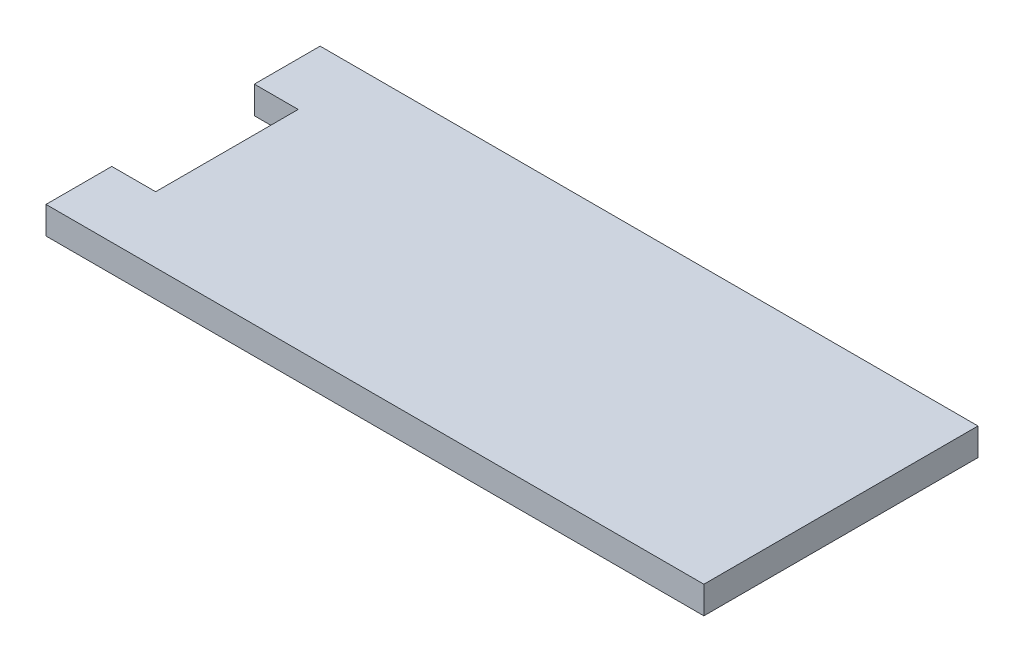
ISO-10303-21;
HEADER;
FILE_DESCRIPTION(('STEP AP214'),'2;1');
FILE_NAME('part.step','',(''),(''),'','','');
FILE_SCHEMA(('AUTOMOTIVE_DESIGN { 1 0 10303 214 1 1 1 1 }'));
ENDSEC;
DATA;
#1=APPLICATION_CONTEXT('core data for automotive mechanical design processes');
#2=APPLICATION_PROTOCOL_DEFINITION('international standard','automotive_design',2000,#1);
#3=PRODUCT_CONTEXT('',#1,'mechanical');
#4=PRODUCT('Part','Part','',(#3));
#5=PRODUCT_RELATED_PRODUCT_CATEGORY('part','',(#4));
#6=PRODUCT_DEFINITION_FORMATION('','',#4);
#7=PRODUCT_DEFINITION_CONTEXT('part definition',#1,'design');
#8=PRODUCT_DEFINITION('design','',#6,#7);
#9=PRODUCT_DEFINITION_SHAPE('','',#8);
#10=(LENGTH_UNIT() NAMED_UNIT(*) SI_UNIT(.MILLI.,.METRE.));
#11=(NAMED_UNIT(*) PLANE_ANGLE_UNIT() SI_UNIT($,.RADIAN.));
#12=(NAMED_UNIT(*) SI_UNIT($,.STERADIAN.) SOLID_ANGLE_UNIT());
#13=UNCERTAINTY_MEASURE_WITH_UNIT(LENGTH_MEASURE(1.E-05),#10,'distance_accuracy_value','');
#14=(GEOMETRIC_REPRESENTATION_CONTEXT(3) GLOBAL_UNCERTAINTY_ASSIGNED_CONTEXT((#13)) GLOBAL_UNIT_ASSIGNED_CONTEXT((#10,
#11,#12)) REPRESENTATION_CONTEXT('',''));
#15=CARTESIAN_POINT('',(0.,0.,0.));
#16=DIRECTION('',(0.,0.,1.));
#17=DIRECTION('',(1.,0.,0.));
#18=AXIS2_PLACEMENT_3D('',#15,#16,#17);
#19=CARTESIAN_POINT('',(-38.1,3.175,-15.875));
#20=DIRECTION('',(1.,0.,0.));
#21=DIRECTION('',(0.,0.,-1.));
#22=AXIS2_PLACEMENT_3D('',#19,#20,#21);
#23=PLANE('',#22);
#24=DIRECTION('',(0.,0.,1.));
#25=VECTOR('',#24,1.);
#26=CARTESIAN_POINT('',(-38.1,0.,-15.875));
#27=LINE('',#26,#25);
#28=CARTESIAN_POINT('',(-38.1,0.,-15.875));
#29=VERTEX_POINT('',#28);
#30=CARTESIAN_POINT('',(-38.1,0.,-8.255));
#31=VERTEX_POINT('',#30);
#32=EDGE_CURVE('E129',#29,#31,#27,.T.);
#33=ORIENTED_EDGE('',*,*,#32,.T.);
#34=DIRECTION('',(0.,1.,0.));
#35=VECTOR('',#34,1.);
#36=CARTESIAN_POINT('',(-38.1,0.,-8.255));
#37=LINE('',#36,#35);
#38=CARTESIAN_POINT('',(-38.1,3.175,-8.255));
#39=VERTEX_POINT('',#38);
#40=EDGE_CURVE('E161',#31,#39,#37,.T.);
#41=ORIENTED_EDGE('',*,*,#40,.T.);
#42=DIRECTION('',(0.,0.,1.));
#43=VECTOR('',#42,1.);
#44=CARTESIAN_POINT('',(-38.1,3.175,-15.875));
#45=LINE('',#44,#43);
#46=CARTESIAN_POINT('',(-38.1,3.175,-15.875));
#47=VERTEX_POINT('',#46);
#48=EDGE_CURVE('E148',#47,#39,#45,.T.);
#49=ORIENTED_EDGE('',*,*,#48,.F.);
#50=DIRECTION('',(0.,-1.,0.));
#51=VECTOR('',#50,1.);
#52=CARTESIAN_POINT('',(-38.1,3.175,-15.875));
#53=LINE('',#52,#51);
#54=EDGE_CURVE('E43',#47,#29,#53,.T.);
#55=ORIENTED_EDGE('',*,*,#54,.T.);
#56=EDGE_LOOP('',(#33,#41,#49,#55));
#57=FACE_BOUND('',#56,.T.);
#58=ADVANCED_FACE('F35',(#57),#23,.F.);
#59=CARTESIAN_POINT('',(38.1,3.175,-15.875));
#60=DIRECTION('',(-1.,0.,0.));
#61=DIRECTION('',(0.,0.,1.));
#62=AXIS2_PLACEMENT_3D('',#59,#60,#61);
#63=PLANE('',#62);
#64=DIRECTION('',(0.,0.,-1.));
#65=VECTOR('',#64,1.);
#66=CARTESIAN_POINT('',(38.1,0.,-15.875));
#67=LINE('',#66,#65);
#68=CARTESIAN_POINT('',(38.1,0.,15.875));
#69=VERTEX_POINT('',#68);
#70=CARTESIAN_POINT('',(38.1,0.,-15.875));
#71=VERTEX_POINT('',#70);
#72=EDGE_CURVE('E133',#69,#71,#67,.T.);
#73=ORIENTED_EDGE('',*,*,#72,.T.);
#74=DIRECTION('',(0.,-1.,0.));
#75=VECTOR('',#74,1.);
#76=CARTESIAN_POINT('',(38.1,3.175,-15.875));
#77=LINE('',#76,#75);
#78=CARTESIAN_POINT('',(38.1,3.175,-15.875));
#79=VERTEX_POINT('',#78);
#80=EDGE_CURVE('E11',#79,#71,#77,.T.);
#81=ORIENTED_EDGE('',*,*,#80,.F.);
#82=DIRECTION('',(0.,0.,-1.));
#83=VECTOR('',#82,1.);
#84=CARTESIAN_POINT('',(38.1,3.175,-15.875));
#85=LINE('',#84,#83);
#86=CARTESIAN_POINT('',(38.1,3.175,15.875));
#87=VERTEX_POINT('',#86);
#88=EDGE_CURVE('E138',#87,#79,#85,.T.);
#89=ORIENTED_EDGE('',*,*,#88,.F.);
#90=DIRECTION('',(0.,-1.,0.));
#91=VECTOR('',#90,1.);
#92=CARTESIAN_POINT('',(38.1,3.175,15.875));
#93=LINE('',#92,#91);
#94=EDGE_CURVE('E139',#87,#69,#93,.T.);
#95=ORIENTED_EDGE('',*,*,#94,.T.);
#96=EDGE_LOOP('',(#73,#81,#89,#95));
#97=FACE_BOUND('',#96,.T.);
#98=ADVANCED_FACE('F37',(#97),#63,.F.);
#99=CARTESIAN_POINT('',(-38.1,3.175,-15.875));
#100=DIRECTION('',(0.,0.,1.));
#101=DIRECTION('',(1.,0.,0.));
#102=AXIS2_PLACEMENT_3D('',#99,#100,#101);
#103=PLANE('',#102);
#104=DIRECTION('',(-1.,0.,0.));
#105=VECTOR('',#104,1.);
#106=CARTESIAN_POINT('',(-38.1,0.,-15.875));
#107=LINE('',#106,#105);
#108=EDGE_CURVE('E130',#71,#29,#107,.T.);
#109=ORIENTED_EDGE('',*,*,#108,.T.);
#110=ORIENTED_EDGE('',*,*,#54,.F.);
#111=DIRECTION('',(-1.,0.,0.));
#112=VECTOR('',#111,1.);
#113=CARTESIAN_POINT('',(-38.1,3.175,-15.875));
#114=LINE('',#113,#112);
#115=EDGE_CURVE('E87',#79,#47,#114,.T.);
#116=ORIENTED_EDGE('',*,*,#115,.F.);
#117=ORIENTED_EDGE('',*,*,#80,.T.);
#118=EDGE_LOOP('',(#109,#110,#116,#117));
#119=FACE_BOUND('',#118,.T.);
#120=ADVANCED_FACE('F182',(#119),#103,.F.);
#121=CARTESIAN_POINT('',(-38.1,3.175,8.25500000000001));
#122=VERTEX_POINT('',#121);
#123=CARTESIAN_POINT('',(-38.1,3.175,15.875));
#124=VERTEX_POINT('',#123);
#125=EDGE_CURVE('E124',#122,#124,#45,.T.);
#126=ORIENTED_EDGE('',*,*,#125,.F.);
#127=DIRECTION('',(0.,1.,0.));
#128=VECTOR('',#127,1.);
#129=CARTESIAN_POINT('',(-38.1,0.,8.25500000000001));
#130=LINE('',#129,#128);
#131=CARTESIAN_POINT('',(-38.1,0.,8.25500000000001));
#132=VERTEX_POINT('',#131);
#133=EDGE_CURVE('E112',#132,#122,#130,.T.);
#134=ORIENTED_EDGE('',*,*,#133,.F.);
#135=CARTESIAN_POINT('',(-38.1,0.,15.875));
#136=VERTEX_POINT('',#135);
#137=EDGE_CURVE('E123',#132,#136,#27,.T.);
#138=ORIENTED_EDGE('',*,*,#137,.T.);
#139=DIRECTION('',(0.,-1.,0.));
#140=VECTOR('',#139,1.);
#141=CARTESIAN_POINT('',(-38.1,3.175,15.875));
#142=LINE('',#141,#140);
#143=EDGE_CURVE('E141',#124,#136,#142,.T.);
#144=ORIENTED_EDGE('',*,*,#143,.F.);
#145=EDGE_LOOP('',(#126,#134,#138,#144));
#146=FACE_BOUND('',#145,.T.);
#147=ADVANCED_FACE('F121',(#146),#23,.F.);
#148=CARTESIAN_POINT('',(-38.1,3.175,15.875));
#149=DIRECTION('',(0.,0.,-1.));
#150=DIRECTION('',(-1.,0.,0.));
#151=AXIS2_PLACEMENT_3D('',#148,#149,#150);
#152=PLANE('',#151);
#153=DIRECTION('',(1.,0.,0.));
#154=VECTOR('',#153,1.);
#155=CARTESIAN_POINT('',(-38.1,0.,15.875));
#156=LINE('',#155,#154);
#157=EDGE_CURVE('E80',#136,#69,#156,.T.);
#158=ORIENTED_EDGE('',*,*,#157,.T.);
#159=ORIENTED_EDGE('',*,*,#94,.F.);
#160=DIRECTION('',(1.,0.,0.));
#161=VECTOR('',#160,1.);
#162=CARTESIAN_POINT('',(-38.1,3.175,15.875));
#163=LINE('',#162,#161);
#164=EDGE_CURVE('E59',#124,#87,#163,.T.);
#165=ORIENTED_EDGE('',*,*,#164,.F.);
#166=ORIENTED_EDGE('',*,*,#143,.T.);
#167=EDGE_LOOP('',(#158,#159,#165,#166));
#168=FACE_BOUND('',#167,.T.);
#169=ADVANCED_FACE('F173',(#168),#152,.F.);
#170=CARTESIAN_POINT('',(0.,3.175,0.));
#171=DIRECTION('',(0.,1.,0.));
#172=DIRECTION('',(0.,0.,1.));
#173=AXIS2_PLACEMENT_3D('',#170,#171,#172);
#174=PLANE('',#173);
#175=DIRECTION('',(-1.,0.,0.));
#176=VECTOR('',#175,1.);
#177=CARTESIAN_POINT('',(-38.1,3.175,-8.255));
#178=LINE('',#177,#176);
#179=CARTESIAN_POINT('',(-33.02,3.175,-8.255));
#180=VERTEX_POINT('',#179);
#181=EDGE_CURVE('E117',#180,#39,#178,.T.);
#182=ORIENTED_EDGE('',*,*,#181,.F.);
#183=DIRECTION('',(0.,0.,-1.));
#184=VECTOR('',#183,1.);
#185=CARTESIAN_POINT('',(-33.02,3.175,-8.255));
#186=LINE('',#185,#184);
#187=CARTESIAN_POINT('',(-33.02,3.175,8.25500000000001));
#188=VERTEX_POINT('',#187);
#189=EDGE_CURVE('E157',#188,#180,#186,.T.);
#190=ORIENTED_EDGE('',*,*,#189,.F.);
#191=DIRECTION('',(1.,0.,0.));
#192=VECTOR('',#191,1.);
#193=CARTESIAN_POINT('',(-38.1,3.175,8.25500000000001));
#194=LINE('',#193,#192);
#195=EDGE_CURVE('E155',#122,#188,#194,.T.);
#196=ORIENTED_EDGE('',*,*,#195,.F.);
#197=ORIENTED_EDGE('',*,*,#125,.T.);
#198=ORIENTED_EDGE('',*,*,#164,.T.);
#199=ORIENTED_EDGE('',*,*,#88,.T.);
#200=ORIENTED_EDGE('',*,*,#115,.T.);
#201=ORIENTED_EDGE('',*,*,#48,.T.);
#202=EDGE_LOOP('',(#182,#190,#196,#197,#198,#199,#200,#201));
#203=FACE_BOUND('',#202,.T.);
#204=ADVANCED_FACE('F175',(#203),#174,.T.);
#205=CARTESIAN_POINT('',(0.,0.,0.));
#206=DIRECTION('',(0.,1.,0.));
#207=DIRECTION('',(0.,0.,1.));
#208=AXIS2_PLACEMENT_3D('',#205,#206,#207);
#209=PLANE('',#208);
#210=DIRECTION('',(0.,0.,-1.));
#211=VECTOR('',#210,1.);
#212=CARTESIAN_POINT('',(-33.02,0.,-8.255));
#213=LINE('',#212,#211);
#214=CARTESIAN_POINT('',(-33.02,0.,8.25500000000001));
#215=VERTEX_POINT('',#214);
#216=CARTESIAN_POINT('',(-33.02,0.,-8.255));
#217=VERTEX_POINT('',#216);
#218=EDGE_CURVE('E50',#215,#217,#213,.T.);
#219=ORIENTED_EDGE('',*,*,#218,.T.);
#220=DIRECTION('',(-1.,0.,0.));
#221=VECTOR('',#220,1.);
#222=CARTESIAN_POINT('',(-38.1,0.,-8.255));
#223=LINE('',#222,#221);
#224=EDGE_CURVE('E125',#217,#31,#223,.T.);
#225=ORIENTED_EDGE('',*,*,#224,.T.);
#226=ORIENTED_EDGE('',*,*,#32,.F.);
#227=ORIENTED_EDGE('',*,*,#108,.F.);
#228=ORIENTED_EDGE('',*,*,#72,.F.);
#229=ORIENTED_EDGE('',*,*,#157,.F.);
#230=ORIENTED_EDGE('',*,*,#137,.F.);
#231=DIRECTION('',(1.,0.,0.));
#232=VECTOR('',#231,1.);
#233=CARTESIAN_POINT('',(-38.1,0.,8.25500000000001));
#234=LINE('',#233,#232);
#235=EDGE_CURVE('E108',#132,#215,#234,.T.);
#236=ORIENTED_EDGE('',*,*,#235,.T.);
#237=EDGE_LOOP('',(#219,#225,#226,#227,#228,#229,#230,#236));
#238=FACE_BOUND('',#237,.T.);
#239=ADVANCED_FACE('F127',(#238),#209,.F.);
#240=CARTESIAN_POINT('',(-38.1,0.,-8.255));
#241=DIRECTION('',(0.,0.,-1.));
#242=DIRECTION('',(-1.,0.,0.));
#243=AXIS2_PLACEMENT_3D('',#240,#241,#242);
#244=PLANE('',#243);
#245=ORIENTED_EDGE('',*,*,#181,.T.);
#246=ORIENTED_EDGE('',*,*,#40,.F.);
#247=ORIENTED_EDGE('',*,*,#224,.F.);
#248=DIRECTION('',(0.,1.,0.));
#249=VECTOR('',#248,1.);
#250=CARTESIAN_POINT('',(-33.02,0.,-8.255));
#251=LINE('',#250,#249);
#252=EDGE_CURVE('E163',#217,#180,#251,.T.);
#253=ORIENTED_EDGE('',*,*,#252,.T.);
#254=EDGE_LOOP('',(#245,#246,#247,#253));
#255=FACE_BOUND('',#254,.T.);
#256=ADVANCED_FACE('F216',(#255),#244,.F.);
#257=CARTESIAN_POINT('',(-33.02,0.,-8.255));
#258=DIRECTION('',(1.,0.,0.));
#259=DIRECTION('',(0.,0.,-1.));
#260=AXIS2_PLACEMENT_3D('',#257,#258,#259);
#261=PLANE('',#260);
#262=ORIENTED_EDGE('',*,*,#189,.T.);
#263=ORIENTED_EDGE('',*,*,#252,.F.);
#264=ORIENTED_EDGE('',*,*,#218,.F.);
#265=DIRECTION('',(0.,1.,0.));
#266=VECTOR('',#265,1.);
#267=CARTESIAN_POINT('',(-33.02,0.,8.25500000000001));
#268=LINE('',#267,#266);
#269=EDGE_CURVE('E114',#215,#188,#268,.T.);
#270=ORIENTED_EDGE('',*,*,#269,.T.);
#271=EDGE_LOOP('',(#262,#263,#264,#270));
#272=FACE_BOUND('',#271,.T.);
#273=ADVANCED_FACE('F224',(#272),#261,.F.);
#274=CARTESIAN_POINT('',(-38.1,0.,8.25500000000001));
#275=DIRECTION('',(0.,0.,1.));
#276=DIRECTION('',(1.,0.,0.));
#277=AXIS2_PLACEMENT_3D('',#274,#275,#276);
#278=PLANE('',#277);
#279=ORIENTED_EDGE('',*,*,#195,.T.);
#280=ORIENTED_EDGE('',*,*,#269,.F.);
#281=ORIENTED_EDGE('',*,*,#235,.F.);
#282=ORIENTED_EDGE('',*,*,#133,.T.);
#283=EDGE_LOOP('',(#279,#280,#281,#282));
#284=FACE_BOUND('',#283,.T.);
#285=ADVANCED_FACE('F111',(#284),#278,.F.);
#286=CLOSED_SHELL('',(#58,#98,#120,#147,#169,#204,#239,#256,#273,#285));
#287=MANIFOLD_SOLID_BREP('B2',#286);
#288=ADVANCED_BREP_SHAPE_REPRESENTATION('',(#18,#287),#14);
#289=SHAPE_DEFINITION_REPRESENTATION(#9,#288);
ENDSEC;
END-ISO-10303-21;
